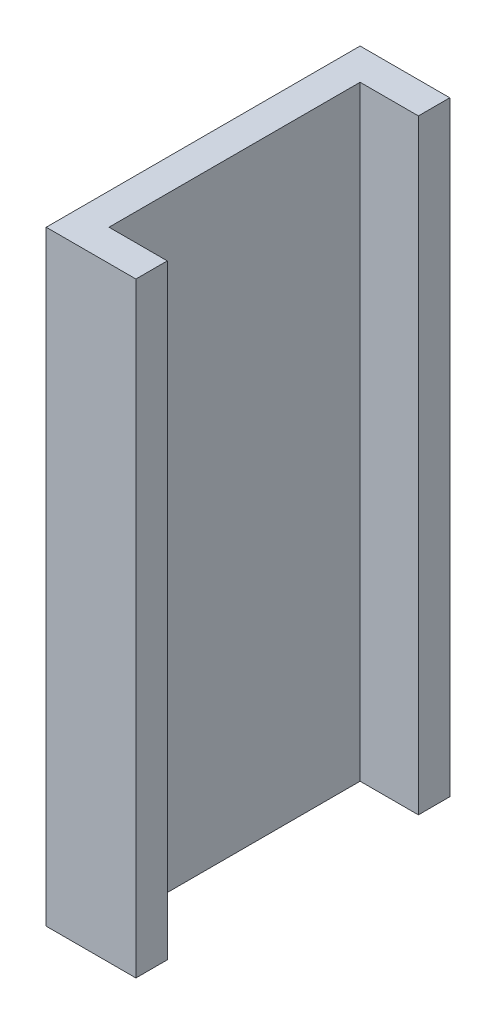
ISO-10303-21;
HEADER;
FILE_DESCRIPTION(('STEP AP214'),'2;1');
FILE_NAME('part.step','',(''),(''),'','','');
FILE_SCHEMA(('AUTOMOTIVE_DESIGN { 1 0 10303 214 1 1 1 1 }'));
ENDSEC;
DATA;
#1=APPLICATION_CONTEXT('core data for automotive mechanical design processes');
#2=APPLICATION_PROTOCOL_DEFINITION('international standard','automotive_design',2000,#1);
#3=PRODUCT_CONTEXT('',#1,'mechanical');
#4=PRODUCT('Part','Part','',(#3));
#5=PRODUCT_RELATED_PRODUCT_CATEGORY('part','',(#4));
#6=PRODUCT_DEFINITION_FORMATION('','',#4);
#7=PRODUCT_DEFINITION_CONTEXT('part definition',#1,'design');
#8=PRODUCT_DEFINITION('design','',#6,#7);
#9=PRODUCT_DEFINITION_SHAPE('','',#8);
#10=(LENGTH_UNIT() NAMED_UNIT(*) SI_UNIT(.MILLI.,.METRE.));
#11=(NAMED_UNIT(*) PLANE_ANGLE_UNIT() SI_UNIT($,.RADIAN.));
#12=(NAMED_UNIT(*) SI_UNIT($,.STERADIAN.) SOLID_ANGLE_UNIT());
#13=UNCERTAINTY_MEASURE_WITH_UNIT(LENGTH_MEASURE(1.E-05),#10,'distance_accuracy_value','');
#14=(GEOMETRIC_REPRESENTATION_CONTEXT(3) GLOBAL_UNCERTAINTY_ASSIGNED_CONTEXT((#13)) GLOBAL_UNIT_ASSIGNED_CONTEXT((#10,
#11,#12)) REPRESENTATION_CONTEXT('',''));
#15=CARTESIAN_POINT('',(0.,0.,0.));
#16=DIRECTION('',(0.,0.,1.));
#17=DIRECTION('',(1.,0.,0.));
#18=AXIS2_PLACEMENT_3D('',#15,#16,#17);
#19=CARTESIAN_POINT('',(0.2,0.,0.));
#20=DIRECTION('',(1.,0.,0.));
#21=DIRECTION('',(0.,1.,0.));
#22=AXIS2_PLACEMENT_3D('',#19,#20,#21);
#23=PLANE('',#22);
#24=DIRECTION('',(0.,0.,1.));
#25=VECTOR('',#24,1.);
#26=CARTESIAN_POINT('',(0.2,0.,0.));
#27=LINE('',#26,#25);
#28=CARTESIAN_POINT('',(0.2,0.,0.63));
#29=VERTEX_POINT('',#28);
#30=CARTESIAN_POINT('',(0.2,0.,0.7));
#31=VERTEX_POINT('',#30);
#32=EDGE_CURVE('E119',#29,#31,#27,.T.);
#33=ORIENTED_EDGE('',*,*,#32,.F.);
#34=DIRECTION('',(0.,-1.,0.));
#35=VECTOR('',#34,1.);
#36=CARTESIAN_POINT('',(0.2,0.,0.63));
#37=LINE('',#36,#35);
#38=CARTESIAN_POINT('',(0.2,1.35,0.63));
#39=VERTEX_POINT('',#38);
#40=EDGE_CURVE('E11',#39,#29,#37,.T.);
#41=ORIENTED_EDGE('',*,*,#40,.F.);
#42=DIRECTION('',(0.,0.,1.));
#43=VECTOR('',#42,1.);
#44=CARTESIAN_POINT('',(0.2,1.35,0.));
#45=LINE('',#44,#43);
#46=CARTESIAN_POINT('',(0.2,1.35,0.7));
#47=VERTEX_POINT('',#46);
#48=EDGE_CURVE('E181',#39,#47,#45,.T.);
#49=ORIENTED_EDGE('',*,*,#48,.T.);
#50=DIRECTION('',(0.,1.,0.));
#51=VECTOR('',#50,1.);
#52=CARTESIAN_POINT('',(0.2,0.,0.7));
#53=LINE('',#52,#51);
#54=EDGE_CURVE('E154',#31,#47,#53,.T.);
#55=ORIENTED_EDGE('',*,*,#54,.F.);
#56=EDGE_LOOP('',(#33,#41,#49,#55));
#57=FACE_BOUND('',#56,.T.);
#58=ADVANCED_FACE('F17',(#57),#23,.T.);
#59=CARTESIAN_POINT('',(0.07,0.,0.63));
#60=DIRECTION('',(0.,0.,1.));
#61=DIRECTION('',(1.,0.,0.));
#62=AXIS2_PLACEMENT_3D('',#59,#60,#61);
#63=PLANE('',#62);
#64=ORIENTED_EDGE('',*,*,#40,.T.);
#65=DIRECTION('',(1.,0.,0.));
#66=VECTOR('',#65,1.);
#67=CARTESIAN_POINT('',(0.07,0.,0.63));
#68=LINE('',#67,#66);
#69=CARTESIAN_POINT('',(0.07,0.,0.63));
#70=VERTEX_POINT('',#69);
#71=EDGE_CURVE('E161',#70,#29,#68,.T.);
#72=ORIENTED_EDGE('',*,*,#71,.F.);
#73=DIRECTION('',(0.,1.,0.));
#74=VECTOR('',#73,1.);
#75=CARTESIAN_POINT('',(0.07,0.,0.63));
#76=LINE('',#75,#74);
#77=CARTESIAN_POINT('',(0.07,1.35,0.63));
#78=VERTEX_POINT('',#77);
#79=EDGE_CURVE('E26',#70,#78,#76,.T.);
#80=ORIENTED_EDGE('',*,*,#79,.T.);
#81=DIRECTION('',(1.,0.,0.));
#82=VECTOR('',#81,1.);
#83=CARTESIAN_POINT('',(0.07,1.35,0.63));
#84=LINE('',#83,#82);
#85=EDGE_CURVE('E184',#78,#39,#84,.T.);
#86=ORIENTED_EDGE('',*,*,#85,.T.);
#87=EDGE_LOOP('',(#64,#72,#80,#86));
#88=FACE_BOUND('',#87,.T.);
#89=ADVANCED_FACE('F348',(#88),#63,.F.);
#90=CARTESIAN_POINT('',(0.07,0.,0.07));
#91=DIRECTION('',(1.,0.,0.));
#92=DIRECTION('',(0.,1.,0.));
#93=AXIS2_PLACEMENT_3D('',#90,#91,#92);
#94=PLANE('',#93);
#95=DIRECTION('',(0.,0.,1.));
#96=VECTOR('',#95,1.);
#97=CARTESIAN_POINT('',(0.07,0.,0.07));
#98=LINE('',#97,#96);
#99=CARTESIAN_POINT('',(0.07,0.,0.07));
#100=VERTEX_POINT('',#99);
#101=EDGE_CURVE('E151',#100,#70,#98,.T.);
#102=ORIENTED_EDGE('',*,*,#101,.F.);
#103=DIRECTION('',(0.,1.,0.));
#104=VECTOR('',#103,1.);
#105=CARTESIAN_POINT('',(0.07,0.,0.07));
#106=LINE('',#105,#104);
#107=CARTESIAN_POINT('',(0.07,1.35,0.07));
#108=VERTEX_POINT('',#107);
#109=EDGE_CURVE('E38',#100,#108,#106,.T.);
#110=ORIENTED_EDGE('',*,*,#109,.T.);
#111=DIRECTION('',(0.,0.,1.));
#112=VECTOR('',#111,1.);
#113=CARTESIAN_POINT('',(0.07,1.35,0.07));
#114=LINE('',#113,#112);
#115=EDGE_CURVE('E188',#108,#78,#114,.T.);
#116=ORIENTED_EDGE('',*,*,#115,.T.);
#117=ORIENTED_EDGE('',*,*,#79,.F.);
#118=EDGE_LOOP('',(#102,#110,#116,#117));
#119=FACE_BOUND('',#118,.T.);
#120=ADVANCED_FACE('F338',(#119),#94,.T.);
#121=CARTESIAN_POINT('',(0.07,0.,0.07));
#122=DIRECTION('',(0.,0.,1.));
#123=DIRECTION('',(1.,0.,0.));
#124=AXIS2_PLACEMENT_3D('',#121,#122,#123);
#125=PLANE('',#124);
#126=DIRECTION('',(1.,0.,0.));
#127=VECTOR('',#126,1.);
#128=CARTESIAN_POINT('',(0.07,1.35,0.07));
#129=LINE('',#128,#127);
#130=CARTESIAN_POINT('',(0.2,1.35,0.07));
#131=VERTEX_POINT('',#130);
#132=EDGE_CURVE('E191',#108,#131,#129,.T.);
#133=ORIENTED_EDGE('',*,*,#132,.F.);
#134=ORIENTED_EDGE('',*,*,#109,.F.);
#135=DIRECTION('',(1.,0.,0.));
#136=VECTOR('',#135,1.);
#137=CARTESIAN_POINT('',(0.07,0.,0.07));
#138=LINE('',#137,#136);
#139=CARTESIAN_POINT('',(0.2,0.,0.07));
#140=VERTEX_POINT('',#139);
#141=EDGE_CURVE('E134',#100,#140,#138,.T.);
#142=ORIENTED_EDGE('',*,*,#141,.T.);
#143=DIRECTION('',(0.,-1.,0.));
#144=VECTOR('',#143,1.);
#145=CARTESIAN_POINT('',(0.2,0.,0.07));
#146=LINE('',#145,#144);
#147=EDGE_CURVE('E53',#131,#140,#146,.T.);
#148=ORIENTED_EDGE('',*,*,#147,.F.);
#149=EDGE_LOOP('',(#133,#134,#142,#148));
#150=FACE_BOUND('',#149,.T.);
#151=ADVANCED_FACE('F329',(#150),#125,.T.);
#152=CARTESIAN_POINT('',(0.2,0.,0.));
#153=DIRECTION('',(1.,0.,0.));
#154=DIRECTION('',(0.,1.,0.));
#155=AXIS2_PLACEMENT_3D('',#152,#153,#154);
#156=PLANE('',#155);
#157=DIRECTION('',(0.,0.,1.));
#158=VECTOR('',#157,1.);
#159=CARTESIAN_POINT('',(0.2,0.,0.));
#160=LINE('',#159,#158);
#161=CARTESIAN_POINT('',(0.2,0.,0.));
#162=VERTEX_POINT('',#161);
#163=EDGE_CURVE('E157',#162,#140,#160,.T.);
#164=ORIENTED_EDGE('',*,*,#163,.F.);
#165=DIRECTION('',(0.,1.,0.));
#166=VECTOR('',#165,1.);
#167=CARTESIAN_POINT('',(0.2,0.,0.));
#168=LINE('',#167,#166);
#169=CARTESIAN_POINT('',(0.2,1.35,0.));
#170=VERTEX_POINT('',#169);
#171=EDGE_CURVE('E67',#162,#170,#168,.T.);
#172=ORIENTED_EDGE('',*,*,#171,.T.);
#173=DIRECTION('',(0.,0.,1.));
#174=VECTOR('',#173,1.);
#175=CARTESIAN_POINT('',(0.2,1.35,0.));
#176=LINE('',#175,#174);
#177=EDGE_CURVE('E168',#170,#131,#176,.T.);
#178=ORIENTED_EDGE('',*,*,#177,.T.);
#179=ORIENTED_EDGE('',*,*,#147,.T.);
#180=EDGE_LOOP('',(#164,#172,#178,#179));
#181=FACE_BOUND('',#180,.T.);
#182=ADVANCED_FACE('F318',(#181),#156,.T.);
#183=CARTESIAN_POINT('',(0.,0.,0.));
#184=DIRECTION('',(0.,0.,1.));
#185=DIRECTION('',(1.,0.,0.));
#186=AXIS2_PLACEMENT_3D('',#183,#184,#185);
#187=PLANE('',#186);
#188=DIRECTION('',(1.,0.,0.));
#189=VECTOR('',#188,1.);
#190=CARTESIAN_POINT('',(0.,1.35,0.));
#191=LINE('',#190,#189);
#192=CARTESIAN_POINT('',(0.,1.35,0.));
#193=VERTEX_POINT('',#192);
#194=EDGE_CURVE('E171',#193,#170,#191,.T.);
#195=ORIENTED_EDGE('',*,*,#194,.T.);
#196=ORIENTED_EDGE('',*,*,#171,.F.);
#197=DIRECTION('',(1.,0.,0.));
#198=VECTOR('',#197,1.);
#199=CARTESIAN_POINT('',(0.,0.,0.));
#200=LINE('',#199,#198);
#201=CARTESIAN_POINT('',(0.,0.,0.));
#202=VERTEX_POINT('',#201);
#203=EDGE_CURVE('E124',#202,#162,#200,.T.);
#204=ORIENTED_EDGE('',*,*,#203,.F.);
#205=DIRECTION('',(0.,1.,0.));
#206=VECTOR('',#205,1.);
#207=CARTESIAN_POINT('',(0.,0.,0.));
#208=LINE('',#207,#206);
#209=EDGE_CURVE('E132',#202,#193,#208,.T.);
#210=ORIENTED_EDGE('',*,*,#209,.T.);
#211=EDGE_LOOP('',(#195,#196,#204,#210));
#212=FACE_BOUND('',#211,.T.);
#213=ADVANCED_FACE('F307',(#212),#187,.F.);
#214=CARTESIAN_POINT('',(0.,1.35,0.));
#215=DIRECTION('',(0.,1.,0.));
#216=DIRECTION('',(1.,0.,0.));
#217=AXIS2_PLACEMENT_3D('',#214,#215,#216);
#218=PLANE('',#217);
#219=ORIENTED_EDGE('',*,*,#177,.F.);
#220=ORIENTED_EDGE('',*,*,#194,.F.);
#221=DIRECTION('',(0.,0.,1.));
#222=VECTOR('',#221,1.);
#223=CARTESIAN_POINT('',(0.,1.35,0.));
#224=LINE('',#223,#222);
#225=CARTESIAN_POINT('',(0.,1.35,0.7));
#226=VERTEX_POINT('',#225);
#227=EDGE_CURVE('E141',#193,#226,#224,.T.);
#228=ORIENTED_EDGE('',*,*,#227,.T.);
#229=DIRECTION('',(1.,0.,0.));
#230=VECTOR('',#229,1.);
#231=CARTESIAN_POINT('',(0.,1.35,0.7));
#232=LINE('',#231,#230);
#233=EDGE_CURVE('E138',#226,#47,#232,.T.);
#234=ORIENTED_EDGE('',*,*,#233,.T.);
#235=ORIENTED_EDGE('',*,*,#48,.F.);
#236=ORIENTED_EDGE('',*,*,#85,.F.);
#237=ORIENTED_EDGE('',*,*,#115,.F.);
#238=ORIENTED_EDGE('',*,*,#132,.T.);
#239=EDGE_LOOP('',(#219,#220,#228,#234,#235,#236,#237,#238));
#240=FACE_BOUND('',#239,.T.);
#241=ADVANCED_FACE('F297',(#240),#218,.T.);
#242=CARTESIAN_POINT('',(0.,0.,0.7));
#243=DIRECTION('',(0.,0.,1.));
#244=DIRECTION('',(1.,0.,0.));
#245=AXIS2_PLACEMENT_3D('',#242,#243,#244);
#246=PLANE('',#245);
#247=DIRECTION('',(0.,1.,0.));
#248=VECTOR('',#247,1.);
#249=CARTESIAN_POINT('',(0.,0.,0.7));
#250=LINE('',#249,#248);
#251=CARTESIAN_POINT('',(0.,0.,0.7));
#252=VERTEX_POINT('',#251);
#253=EDGE_CURVE('E130',#252,#226,#250,.T.);
#254=ORIENTED_EDGE('',*,*,#253,.F.);
#255=DIRECTION('',(1.,0.,0.));
#256=VECTOR('',#255,1.);
#257=CARTESIAN_POINT('',(0.,0.,0.7));
#258=LINE('',#257,#256);
#259=EDGE_CURVE('E110',#252,#31,#258,.T.);
#260=ORIENTED_EDGE('',*,*,#259,.T.);
#261=ORIENTED_EDGE('',*,*,#54,.T.);
#262=ORIENTED_EDGE('',*,*,#233,.F.);
#263=EDGE_LOOP('',(#254,#260,#261,#262));
#264=FACE_BOUND('',#263,.T.);
#265=ADVANCED_FACE('F136',(#264),#246,.T.);
#266=CARTESIAN_POINT('',(0.,0.,0.));
#267=DIRECTION('',(0.,1.,0.));
#268=DIRECTION('',(1.,0.,0.));
#269=AXIS2_PLACEMENT_3D('',#266,#267,#268);
#270=PLANE('',#269);
#271=ORIENTED_EDGE('',*,*,#141,.F.);
#272=ORIENTED_EDGE('',*,*,#101,.T.);
#273=ORIENTED_EDGE('',*,*,#71,.T.);
#274=ORIENTED_EDGE('',*,*,#32,.T.);
#275=ORIENTED_EDGE('',*,*,#259,.F.);
#276=DIRECTION('',(0.,0.,1.));
#277=VECTOR('',#276,1.);
#278=CARTESIAN_POINT('',(0.,0.,0.));
#279=LINE('',#278,#277);
#280=EDGE_CURVE('E115',#202,#252,#279,.T.);
#281=ORIENTED_EDGE('',*,*,#280,.F.);
#282=ORIENTED_EDGE('',*,*,#203,.T.);
#283=ORIENTED_EDGE('',*,*,#163,.T.);
#284=EDGE_LOOP('',(#271,#272,#273,#274,#275,#281,#282,#283));
#285=FACE_BOUND('',#284,.T.);
#286=ADVANCED_FACE('F113',(#285),#270,.F.);
#287=CARTESIAN_POINT('',(0.,0.,0.));
#288=DIRECTION('',(1.,0.,0.));
#289=DIRECTION('',(0.,1.,0.));
#290=AXIS2_PLACEMENT_3D('',#287,#288,#289);
#291=PLANE('',#290);
#292=ORIENTED_EDGE('',*,*,#253,.T.);
#293=ORIENTED_EDGE('',*,*,#227,.F.);
#294=ORIENTED_EDGE('',*,*,#209,.F.);
#295=ORIENTED_EDGE('',*,*,#280,.T.);
#296=EDGE_LOOP('',(#292,#293,#294,#295));
#297=FACE_BOUND('',#296,.T.);
#298=ADVANCED_FACE('F128',(#297),#291,.F.);
#299=CLOSED_SHELL('',(#58,#89,#120,#151,#182,#213,#241,#265,#286,#298));
#300=MANIFOLD_SOLID_BREP('B1',#299);
#301=ADVANCED_BREP_SHAPE_REPRESENTATION('',(#18,#300),#14);
#302=SHAPE_DEFINITION_REPRESENTATION(#9,#301);
ENDSEC;
END-ISO-10303-21;
